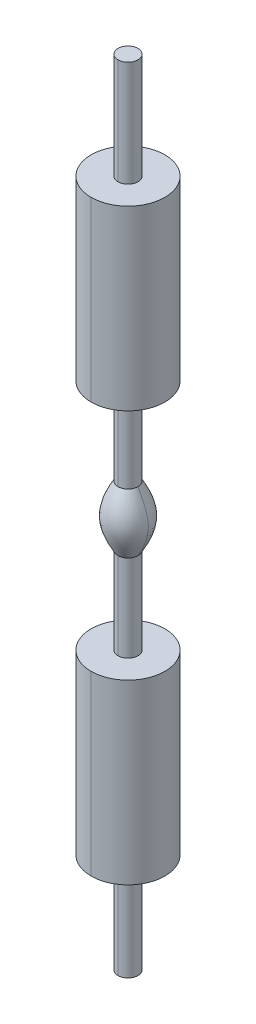
ISO-10303-21;
HEADER;
FILE_DESCRIPTION(('STEP AP214'),'2;1');
FILE_NAME('part.step','',(''),(''),'','','');
FILE_SCHEMA(('AUTOMOTIVE_DESIGN { 1 0 10303 214 1 1 1 1 }'));
ENDSEC;
DATA;
#1=APPLICATION_CONTEXT('core data for automotive mechanical design processes');
#2=APPLICATION_PROTOCOL_DEFINITION('international standard','automotive_design',2000,#1);
#3=PRODUCT_CONTEXT('',#1,'mechanical');
#4=PRODUCT('Part','Part','',(#3));
#5=PRODUCT_RELATED_PRODUCT_CATEGORY('part','',(#4));
#6=PRODUCT_DEFINITION_FORMATION('','',#4);
#7=PRODUCT_DEFINITION_CONTEXT('part definition',#1,'design');
#8=PRODUCT_DEFINITION('design','',#6,#7);
#9=PRODUCT_DEFINITION_SHAPE('','',#8);
#10=(LENGTH_UNIT() NAMED_UNIT(*) SI_UNIT(.MILLI.,.METRE.));
#11=(NAMED_UNIT(*) PLANE_ANGLE_UNIT() SI_UNIT($,.RADIAN.));
#12=(NAMED_UNIT(*) SI_UNIT($,.STERADIAN.) SOLID_ANGLE_UNIT());
#13=UNCERTAINTY_MEASURE_WITH_UNIT(LENGTH_MEASURE(1.E-05),#10,'distance_accuracy_value','');
#14=(GEOMETRIC_REPRESENTATION_CONTEXT(3) GLOBAL_UNCERTAINTY_ASSIGNED_CONTEXT((#13)) GLOBAL_UNIT_ASSIGNED_CONTEXT((#10,
#11,#12)) REPRESENTATION_CONTEXT('',''));
#15=CARTESIAN_POINT('',(0.,0.,0.));
#16=DIRECTION('',(0.,0.,1.));
#17=DIRECTION('',(1.,0.,0.));
#18=AXIS2_PLACEMENT_3D('',#15,#16,#17);
#19=CARTESIAN_POINT('',(0.500005206906543,18.7499969912657,0.));
#20=CARTESIAN_POINT('',(0.788928945114137,19.250007545074,0.));
#21=CARTESIAN_POINT('',(1.2503067253457,20.2500095556672,0.));
#22=CARTESIAN_POINT('',(0.788918573062737,21.2500115662508,0.));
#23=CARTESIAN_POINT('',(0.50000523162838,21.7500030230261,0.));
#24=(BOUNDED_CURVE() B_SPLINE_CURVE(3,(#19,#20,#21,#22,#23),.UNSPECIFIED.,.F.,
.F.) B_SPLINE_CURVE_WITH_KNOTS((4,1,4),(0.00909220591544138,0.5,0.990889044715894),
.UNSPECIFIED.) CURVE() GEOMETRIC_REPRESENTATION_ITEM() RATIONAL_B_SPLINE_CURVE((1.,1.,1.,1.,1.)) REPRESENTATION_ITEM(''));
#25=CARTESIAN_POINT('',(0.,21.9,0.));
#26=DIRECTION('',(0.,1.,0.));
#27=AXIS1_PLACEMENT('',#25,#26);
#28=SURFACE_OF_REVOLUTION('',#24,#27);
#29=CARTESIAN_POINT('',(0.500005206906542,18.7499969912657,0.));
#30=CARTESIAN_POINT('',(0.535846983327023,18.8120600065663,0.));
#31=CARTESIAN_POINT('',(0.571056216291898,18.8745129548328,0.));
#32=CARTESIAN_POINT('',(0.638943417699987,18.9994386156263,0.));
#33=CARTESIAN_POINT('',(0.671653651453235,19.0618938693806,0.));
#34=CARTESIAN_POINT('',(0.733881610883783,19.186841608421,0.));
#35=CARTESIAN_POINT('',(0.763450040943707,19.2493084498713,0.));
#36=CARTESIAN_POINT('',(0.80511160293922,19.3435696616243,0.));
#37=CARTESIAN_POINT('',(0.818448100943745,19.3748159722982,0.));
#38=CARTESIAN_POINT('',(0.844067404996357,19.4373145015259,0.));
#39=CARTESIAN_POINT('',(0.856360675567738,19.4685624113392,0.));
#40=CARTESIAN_POINT('',(0.87980800049009,19.5310638558944,0.));
#41=CARTESIAN_POINT('',(0.890973780078939,19.5623129783757,0.));
#42=CARTESIAN_POINT('',(0.912080674958987,19.6248172506307,0.));
#43=CARTESIAN_POINT('',(0.922034570370944,19.6560680674567,0.));
#44=CARTESIAN_POINT('',(0.940632493940187,19.718575705622,0.));
#45=CARTESIAN_POINT('',(0.949290011534879,19.7498284955897,0.));
#46=CARTESIAN_POINT('',(0.965210355596672,19.812339889142,0.));
#47=CARTESIAN_POINT('',(0.972486865215127,19.8435949896733,0.));
#48=CARTESIAN_POINT('',(0.985560933267878,19.9061105443433,0.));
#49=CARTESIAN_POINT('',(0.991371655645388,19.9373682283626,0.));
#50=CARTESIAN_POINT('',(1.00143065377806,19.9998883304118,0.));
#51=CARTESIAN_POINT('',(1.00569064820225,20.0311488480305,0.));
#52=CARTESIAN_POINT('',(1.01256569576742,20.0936736611226,0.));
#53=CARTESIAN_POINT('',(1.01518988744364,20.1249369416686,0.));
#54=CARTESIAN_POINT('',(1.01871198259125,20.1874670177884,0.));
#55=CARTESIAN_POINT('',(1.01961513631079,20.2187335107372,0.));
#56=CARTESIAN_POINT('',(1.0196153480541,20.2812664978396,0.));
#57=CARTESIAN_POINT('',(1.01871240640828,20.3125329919933,0.));
#58=CARTESIAN_POINT('',(1.01519067392152,20.3750630700732,0.));
#59=CARTESIAN_POINT('',(1.01256663303009,20.406326351417,0.));
#60=CARTESIAN_POINT('',(1.00569184793072,20.4688511659366,0.));
#61=CARTESIAN_POINT('',(1.00143196506839,20.5001116842078,0.));
#62=CARTESIAN_POINT('',(0.99137315092561,20.5626317873683,0.));
#63=CARTESIAN_POINT('',(0.985562500581587,20.5938894718171,0.));
#64=CARTESIAN_POINT('',(0.97248854329119,20.6564050272477,0.));
#65=CARTESIAN_POINT('',(0.965212071887006,20.6876601280238,0.));
#66=CARTESIAN_POINT('',(0.949291775049025,20.7501715220356,0.));
#67=CARTESIAN_POINT('',(0.94063426590677,20.781424312085,0.));
#68=CARTESIAN_POINT('',(0.922036334493111,20.8439319504441,0.));
#69=CARTESIAN_POINT('',(0.912082422254795,20.8751827672215,0.));
#70=CARTESIAN_POINT('',(0.890975473248938,20.9376870394469,0.));
#71=CARTESIAN_POINT('',(0.879809655899945,20.9689361617792,0.));
#72=CARTESIAN_POINT('',(0.856362239265325,21.0314376061206,0.));
#73=CARTESIAN_POINT('',(0.844068914373943,21.0626855157126,0.));
#74=CARTESIAN_POINT('',(0.818449489713174,21.1251840445771,0.));
#75=CARTESIAN_POINT('',(0.805112925153988,21.1564303549789,0.));
#76=CARTESIAN_POINT('',(0.76345114885323,21.2506915706206,0.));
#77=CARTESIAN_POINT('',(0.733882562637891,21.3131584095936,0.));
#78=CARTESIAN_POINT('',(0.671654295067989,21.4381061436226,0.));
#79=CARTESIAN_POINT('',(0.638943909404111,21.5005613947399,0.));
#80=CARTESIAN_POINT('',(0.571056440904352,21.6254870497,0.));
#81=CARTESIAN_POINT('',(0.535847093723119,21.6879399952251,0.));
#82=CARTESIAN_POINT('',(0.50000523162838,21.7500030230261,0.));
#83=B_SPLINE_CURVE_WITH_KNOTS('',3,(#29,#30,#31,#32,#33,#34,#35,#36,#37,#38,#39,#40,#41,#42,#43,
#44,#45,#46,#47,#48,#49,#50,#51,#52,#53,#54,#55,#56,#57,#58,#59,#60,#61,#62,#63,#64,#65,#66,#67,
#68,#69,#70,#71,#72,#73,#74,#75,#76,#77,#78,#79,#80,#81,#82),.UNSPECIFIED.,.F.,.F.,(4,2,2,2,2,2,
2,2,2,2,2,2,2,2,2,2,2,2,2,2,2,2,2,2,2,2,4),(0.,0.215034553041201,0.426507641724073,
0.633758188331105,0.735667144112722,0.836388987457099,0.935923000818633,1.03429452875705,
1.13155817921819,1.22780109173302,1.32314614809787,1.41775495347117,1.51183036809049,
1.60561833119817,1.69940627714775,1.79348165327409,1.88809041360923,1.98343542993342,
2.07967831584223,2.17694195870048,2.27531350103307,2.37484755152487,2.47556945354093,
2.57747848671433,2.78472922644701,2.99620252059585,3.21123723561501),.UNSPECIFIED.);
#84=CARTESIAN_POINT('',(0.5,18.75,0.));
#85=VERTEX_POINT('',#84);
#86=CARTESIAN_POINT('',(0.5,21.75,0.));
#87=VERTEX_POINT('',#86);
#88=EDGE_CURVE('E547',#85,#87,#83,.T.);
#89=ORIENTED_EDGE('',*,*,#88,.F.);
#90=CARTESIAN_POINT('',(0.,18.75,0.));
#91=DIRECTION('',(0.,1.,0.));
#92=DIRECTION('',(1.,0.,0.));
#93=AXIS2_PLACEMENT_3D('',#90,#91,#92);
#94=CIRCLE('',#93,0.5);
#95=CARTESIAN_POINT('',(0.,18.75,-0.5));
#96=VERTEX_POINT('',#95);
#97=EDGE_CURVE('E102',#85,#96,#94,.T.);
#98=ORIENTED_EDGE('',*,*,#97,.T.);
#99=CARTESIAN_POINT('',(0.,18.75,0.));
#100=DIRECTION('',(0.,1.,0.));
#101=DIRECTION('',(0.,0.,-1.));
#102=AXIS2_PLACEMENT_3D('',#99,#100,#101);
#103=CIRCLE('',#102,0.5);
#104=CARTESIAN_POINT('',(-0.5,18.75,0.));
#105=VERTEX_POINT('',#104);
#106=EDGE_CURVE('E171',#96,#105,#103,.T.);
#107=ORIENTED_EDGE('',*,*,#106,.T.);
#108=CARTESIAN_POINT('',(-0.500005206906542,18.7499969912657,0.));
#109=CARTESIAN_POINT('',(-0.535846983327023,18.8120600065663,0.));
#110=CARTESIAN_POINT('',(-0.571056216291898,18.8745129548328,0.));
#111=CARTESIAN_POINT('',(-0.638943417699987,18.9994386156263,0.));
#112=CARTESIAN_POINT('',(-0.671653651453235,19.0618938693806,0.));
#113=CARTESIAN_POINT('',(-0.733881610883783,19.186841608421,0.));
#114=CARTESIAN_POINT('',(-0.763450040943707,19.2493084498713,0.));
#115=CARTESIAN_POINT('',(-0.80511160293922,19.3435696616243,0.));
#116=CARTESIAN_POINT('',(-0.818448100943745,19.3748159722982,0.));
#117=CARTESIAN_POINT('',(-0.844067404996357,19.4373145015259,0.));
#118=CARTESIAN_POINT('',(-0.856360675567738,19.4685624113392,0.));
#119=CARTESIAN_POINT('',(-0.87980800049009,19.5310638558944,0.));
#120=CARTESIAN_POINT('',(-0.890973780078939,19.5623129783757,0.));
#121=CARTESIAN_POINT('',(-0.912080674958987,19.6248172506307,0.));
#122=CARTESIAN_POINT('',(-0.922034570370944,19.6560680674567,0.));
#123=CARTESIAN_POINT('',(-0.940632493940187,19.718575705622,0.));
#124=CARTESIAN_POINT('',(-0.949290011534879,19.7498284955897,0.));
#125=CARTESIAN_POINT('',(-0.965210355596672,19.812339889142,0.));
#126=CARTESIAN_POINT('',(-0.972486865215127,19.8435949896733,0.));
#127=CARTESIAN_POINT('',(-0.985560933267878,19.9061105443433,0.));
#128=CARTESIAN_POINT('',(-0.991371655645388,19.9373682283626,0.));
#129=CARTESIAN_POINT('',(-1.00143065377806,19.9998883304118,0.));
#130=CARTESIAN_POINT('',(-1.00569064820225,20.0311488480305,0.));
#131=CARTESIAN_POINT('',(-1.01256569576742,20.0936736611226,0.));
#132=CARTESIAN_POINT('',(-1.01518988744364,20.1249369416686,0.));
#133=CARTESIAN_POINT('',(-1.01871198259125,20.1874670177884,0.));
#134=CARTESIAN_POINT('',(-1.01961513631079,20.2187335107372,0.));
#135=CARTESIAN_POINT('',(-1.0196153480541,20.2812664978396,0.));
#136=CARTESIAN_POINT('',(-1.01871240640828,20.3125329919933,0.));
#137=CARTESIAN_POINT('',(-1.01519067392152,20.3750630700732,0.));
#138=CARTESIAN_POINT('',(-1.01256663303009,20.406326351417,0.));
#139=CARTESIAN_POINT('',(-1.00569184793072,20.4688511659366,0.));
#140=CARTESIAN_POINT('',(-1.00143196506839,20.5001116842078,0.));
#141=CARTESIAN_POINT('',(-0.99137315092561,20.5626317873683,0.));
#142=CARTESIAN_POINT('',(-0.985562500581587,20.5938894718171,0.));
#143=CARTESIAN_POINT('',(-0.97248854329119,20.6564050272477,0.));
#144=CARTESIAN_POINT('',(-0.965212071887006,20.6876601280238,0.));
#145=CARTESIAN_POINT('',(-0.949291775049025,20.7501715220356,0.));
#146=CARTESIAN_POINT('',(-0.94063426590677,20.781424312085,0.));
#147=CARTESIAN_POINT('',(-0.922036334493111,20.8439319504441,0.));
#148=CARTESIAN_POINT('',(-0.912082422254795,20.8751827672215,0.));
#149=CARTESIAN_POINT('',(-0.890975473248938,20.9376870394469,0.));
#150=CARTESIAN_POINT('',(-0.879809655899945,20.9689361617792,0.));
#151=CARTESIAN_POINT('',(-0.856362239265325,21.0314376061206,0.));
#152=CARTESIAN_POINT('',(-0.844068914373943,21.0626855157126,0.));
#153=CARTESIAN_POINT('',(-0.818449489713174,21.1251840445771,0.));
#154=CARTESIAN_POINT('',(-0.805112925153988,21.1564303549789,0.));
#155=CARTESIAN_POINT('',(-0.76345114885323,21.2506915706206,0.));
#156=CARTESIAN_POINT('',(-0.733882562637891,21.3131584095936,0.));
#157=CARTESIAN_POINT('',(-0.671654295067989,21.4381061436226,0.));
#158=CARTESIAN_POINT('',(-0.638943909404111,21.5005613947399,0.));
#159=CARTESIAN_POINT('',(-0.571056440904352,21.6254870497,0.));
#160=CARTESIAN_POINT('',(-0.535847093723119,21.6879399952251,0.));
#161=CARTESIAN_POINT('',(-0.50000523162838,21.7500030230261,0.));
#162=B_SPLINE_CURVE_WITH_KNOTS('',3,(#108,#109,#110,#111,#112,#113,#114,#115,#116,#117,#118,
#119,#120,#121,#122,#123,#124,#125,#126,#127,#128,#129,#130,#131,#132,#133,#134,#135,#136,#137,
#138,#139,#140,#141,#142,#143,#144,#145,#146,#147,#148,#149,#150,#151,#152,#153,#154,#155,#156,
#157,#158,#159,#160,#161),.UNSPECIFIED.,.F.,.F.,(4,2,2,2,2,2,2,2,2,2,2,2,2,2,2,2,2,2,2,2,2,2,2,
2,2,2,4),(0.,0.215034553041201,0.426507641724073,0.633758188331105,0.735667144112722,
0.836388987457099,0.935923000818633,1.03429452875705,1.13155817921819,1.22780109173302,
1.32314614809787,1.41775495347117,1.51183036809049,1.60561833119817,1.69940627714775,
1.79348165327409,1.88809041360923,1.98343542993342,2.07967831584223,2.17694195870048,
2.27531350103307,2.37484755152487,2.47556945354093,2.57747848671433,2.78472922644701,
2.99620252059585,3.21123723561501),.UNSPECIFIED.);
#163=CARTESIAN_POINT('',(-0.5,21.75,0.));
#164=VERTEX_POINT('',#163);
#165=EDGE_CURVE('E155',#105,#164,#162,.T.);
#166=ORIENTED_EDGE('',*,*,#165,.T.);
#167=CARTESIAN_POINT('',(0.,21.75,0.));
#168=DIRECTION('',(0.,-1.,0.));
#169=DIRECTION('',(-1.,0.,0.));
#170=AXIS2_PLACEMENT_3D('',#167,#168,#169);
#171=CIRCLE('',#170,0.5);
#172=CARTESIAN_POINT('',(0.,21.75,-0.5));
#173=VERTEX_POINT('',#172);
#174=EDGE_CURVE('E181',#164,#173,#171,.T.);
#175=ORIENTED_EDGE('',*,*,#174,.T.);
#176=CARTESIAN_POINT('',(0.,21.75,0.));
#177=DIRECTION('',(0.,-1.,0.));
#178=DIRECTION('',(0.,0.,-1.));
#179=AXIS2_PLACEMENT_3D('',#176,#177,#178);
#180=CIRCLE('',#179,0.5);
#181=EDGE_CURVE('E229',#173,#87,#180,.T.);
#182=ORIENTED_EDGE('',*,*,#181,.T.);
#183=EDGE_LOOP('',(#89,#98,#107,#166,#175,#182));
#184=FACE_BOUND('',#183,.T.);
#185=ADVANCED_FACE('F17',(#184),#28,.T.);
#186=CARTESIAN_POINT('',(0.,40.3,0.));
#187=DIRECTION('',(0.,-1.,0.));
#188=DIRECTION('',(0.,0.,-1.));
#189=AXIS2_PLACEMENT_3D('',#186,#187,#188);
#190=PLANE('',#189);
#191=CARTESIAN_POINT('',(0.,40.3,0.));
#192=DIRECTION('',(0.,-1.,0.));
#193=DIRECTION('',(0.,0.,-1.));
#194=AXIS2_PLACEMENT_3D('',#191,#192,#193);
#195=CIRCLE('',#194,0.5);
#196=CARTESIAN_POINT('',(0.,40.3,-0.5));
#197=VERTEX_POINT('',#196);
#198=CARTESIAN_POINT('',(0.,40.3,0.5));
#199=VERTEX_POINT('',#198);
#200=EDGE_CURVE('E80',#197,#199,#195,.T.);
#201=ORIENTED_EDGE('',*,*,#200,.F.);
#202=CARTESIAN_POINT('',(0.,40.3,0.));
#203=DIRECTION('',(0.,1.,0.));
#204=DIRECTION('',(0.,0.,-1.));
#205=AXIS2_PLACEMENT_3D('',#202,#203,#204);
#206=CIRCLE('',#205,0.5);
#207=EDGE_CURVE('E11',#197,#199,#206,.T.);
#208=ORIENTED_EDGE('',*,*,#207,.T.);
#209=EDGE_LOOP('',(#201,#208));
#210=FACE_BOUND('',#209,.T.);
#211=ADVANCED_FACE('F128',(#210),#190,.F.);
#212=CARTESIAN_POINT('',(0.,41.345,0.));
#213=DIRECTION('',(0.,-1.,0.));
#214=DIRECTION('',(0.,0.,1.));
#215=AXIS2_PLACEMENT_3D('',#212,#213,#214);
#216=CYLINDRICAL_SURFACE('',#215,0.5);
#217=CARTESIAN_POINT('',(0.,35.,0.));
#218=DIRECTION('',(0.,1.,0.));
#219=DIRECTION('',(0.,0.,-1.));
#220=AXIS2_PLACEMENT_3D('',#217,#218,#219);
#221=CIRCLE('',#220,0.5);
#222=CARTESIAN_POINT('',(0.,35.,-0.5));
#223=VERTEX_POINT('',#222);
#224=CARTESIAN_POINT('',(0.,35.,0.5));
#225=VERTEX_POINT('',#224);
#226=EDGE_CURVE('E69',#223,#225,#221,.T.);
#227=ORIENTED_EDGE('',*,*,#226,.T.);
#228=DIRECTION('',(0.,1.,0.));
#229=VECTOR('',#228,1.);
#230=CARTESIAN_POINT('',(0.,35.,0.5));
#231=LINE('',#230,#229);
#232=EDGE_CURVE('E73',#225,#199,#231,.T.);
#233=ORIENTED_EDGE('',*,*,#232,.T.);
#234=ORIENTED_EDGE('',*,*,#207,.F.);
#235=DIRECTION('',(0.,1.,0.));
#236=VECTOR('',#235,1.);
#237=CARTESIAN_POINT('',(0.,35.,-0.5));
#238=LINE('',#237,#236);
#239=EDGE_CURVE('E29',#223,#197,#238,.T.);
#240=ORIENTED_EDGE('',*,*,#239,.F.);
#241=EDGE_LOOP('',(#227,#233,#234,#240));
#242=FACE_BOUND('',#241,.T.);
#243=ADVANCED_FACE('F67',(#242),#216,.T.);
#244=CARTESIAN_POINT('',(0.,41.345,0.));
#245=DIRECTION('',(0.,-1.,0.));
#246=DIRECTION('',(0.,0.,1.));
#247=AXIS2_PLACEMENT_3D('',#244,#245,#246);
#248=CYLINDRICAL_SURFACE('',#247,0.5);
#249=ORIENTED_EDGE('',*,*,#200,.T.);
#250=ORIENTED_EDGE('',*,*,#232,.F.);
#251=CARTESIAN_POINT('',(0.,35.,0.));
#252=DIRECTION('',(0.,-1.,0.));
#253=DIRECTION('',(0.,0.,-1.));
#254=AXIS2_PLACEMENT_3D('',#251,#252,#253);
#255=CIRCLE('',#254,0.5);
#256=EDGE_CURVE('E76',#223,#225,#255,.T.);
#257=ORIENTED_EDGE('',*,*,#256,.F.);
#258=ORIENTED_EDGE('',*,*,#239,.T.);
#259=EDGE_LOOP('',(#249,#250,#257,#258));
#260=FACE_BOUND('',#259,.T.);
#261=ADVANCED_FACE('F77',(#260),#248,.T.);
#262=CARTESIAN_POINT('',(0.,35.,0.));
#263=DIRECTION('',(0.,-1.,0.));
#264=DIRECTION('',(0.,0.,-1.));
#265=AXIS2_PLACEMENT_3D('',#262,#263,#264);
#266=PLANE('',#265);
#267=ORIENTED_EDGE('',*,*,#226,.F.);
#268=ORIENTED_EDGE('',*,*,#256,.T.);
#269=EDGE_LOOP('',(#267,#268));
#270=FACE_BOUND('',#269,.T.);
#271=CARTESIAN_POINT('',(0.,35.,0.));
#272=DIRECTION('',(0.,-1.,0.));
#273=DIRECTION('',(0.,0.,-1.));
#274=AXIS2_PLACEMENT_3D('',#271,#272,#273);
#275=CIRCLE('',#274,1.85);
#276=CARTESIAN_POINT('',(0.,35.,-1.85));
#277=VERTEX_POINT('',#276);
#278=CARTESIAN_POINT('',(0.,35.,1.85));
#279=VERTEX_POINT('',#278);
#280=EDGE_CURVE('E95',#277,#279,#275,.T.);
#281=ORIENTED_EDGE('',*,*,#280,.F.);
#282=CARTESIAN_POINT('',(0.,35.,0.));
#283=DIRECTION('',(0.,1.,0.));
#284=DIRECTION('',(0.,0.,-1.));
#285=AXIS2_PLACEMENT_3D('',#282,#283,#284);
#286=CIRCLE('',#285,1.85);
#287=EDGE_CURVE('E85',#277,#279,#286,.T.);
#288=ORIENTED_EDGE('',*,*,#287,.T.);
#289=EDGE_LOOP('',(#281,#288));
#290=FACE_BOUND('',#289,.T.);
#291=ADVANCED_FACE('F82',(#270,#290),#266,.F.);
#292=CARTESIAN_POINT('',(0.,41.345,0.));
#293=DIRECTION('',(0.,-1.,0.));
#294=DIRECTION('',(0.,0.,1.));
#295=AXIS2_PLACEMENT_3D('',#292,#293,#294);
#296=CYLINDRICAL_SURFACE('',#295,1.85);
#297=CARTESIAN_POINT('',(0.,26.1,0.));
#298=DIRECTION('',(0.,1.,0.));
#299=DIRECTION('',(0.,0.,-1.));
#300=AXIS2_PLACEMENT_3D('',#297,#298,#299);
#301=CIRCLE('',#300,1.85);
#302=CARTESIAN_POINT('',(0.,26.1,-1.85));
#303=VERTEX_POINT('',#302);
#304=CARTESIAN_POINT('',(0.,26.1,1.85));
#305=VERTEX_POINT('',#304);
#306=EDGE_CURVE('E97',#303,#305,#301,.T.);
#307=ORIENTED_EDGE('',*,*,#306,.T.);
#308=DIRECTION('',(0.,1.,0.));
#309=VECTOR('',#308,1.);
#310=CARTESIAN_POINT('',(0.,26.1,1.85));
#311=LINE('',#310,#309);
#312=EDGE_CURVE('E106',#305,#279,#311,.T.);
#313=ORIENTED_EDGE('',*,*,#312,.T.);
#314=ORIENTED_EDGE('',*,*,#287,.F.);
#315=DIRECTION('',(0.,1.,0.));
#316=VECTOR('',#315,1.);
#317=CARTESIAN_POINT('',(0.,26.1,-1.85));
#318=LINE('',#317,#316);
#319=EDGE_CURVE('E91',#303,#277,#318,.T.);
#320=ORIENTED_EDGE('',*,*,#319,.F.);
#321=EDGE_LOOP('',(#307,#313,#314,#320));
#322=FACE_BOUND('',#321,.T.);
#323=ADVANCED_FACE('F356',(#322),#296,.T.);
#324=CARTESIAN_POINT('',(0.,41.345,0.));
#325=DIRECTION('',(0.,-1.,0.));
#326=DIRECTION('',(0.,0.,1.));
#327=AXIS2_PLACEMENT_3D('',#324,#325,#326);
#328=CYLINDRICAL_SURFACE('',#327,1.85);
#329=ORIENTED_EDGE('',*,*,#280,.T.);
#330=ORIENTED_EDGE('',*,*,#312,.F.);
#331=CARTESIAN_POINT('',(0.,26.1,0.));
#332=DIRECTION('',(0.,-1.,0.));
#333=DIRECTION('',(0.,0.,-1.));
#334=AXIS2_PLACEMENT_3D('',#331,#332,#333);
#335=CIRCLE('',#334,1.85);
#336=EDGE_CURVE('E101',#303,#305,#335,.T.);
#337=ORIENTED_EDGE('',*,*,#336,.F.);
#338=ORIENTED_EDGE('',*,*,#319,.T.);
#339=EDGE_LOOP('',(#329,#330,#337,#338));
#340=FACE_BOUND('',#339,.T.);
#341=ADVANCED_FACE('F351',(#340),#328,.T.);
#342=CARTESIAN_POINT('',(0.,26.1,0.));
#343=DIRECTION('',(0.,-1.,0.));
#344=DIRECTION('',(0.,0.,-1.));
#345=AXIS2_PLACEMENT_3D('',#342,#343,#344);
#346=PLANE('',#345);
#347=CARTESIAN_POINT('',(0.,26.1,0.));
#348=DIRECTION('',(0.,-1.,0.));
#349=DIRECTION('',(0.,0.,-1.));
#350=AXIS2_PLACEMENT_3D('',#347,#348,#349);
#351=CIRCLE('',#350,0.5);
#352=CARTESIAN_POINT('',(0.,26.1,-0.5));
#353=VERTEX_POINT('',#352);
#354=CARTESIAN_POINT('',(0.,26.1,0.5));
#355=VERTEX_POINT('',#354);
#356=EDGE_CURVE('E227',#353,#355,#351,.T.);
#357=ORIENTED_EDGE('',*,*,#356,.F.);
#358=CARTESIAN_POINT('',(0.,26.1,0.));
#359=DIRECTION('',(0.,1.,0.));
#360=DIRECTION('',(0.,0.,-1.));
#361=AXIS2_PLACEMENT_3D('',#358,#359,#360);
#362=CIRCLE('',#361,0.5);
#363=EDGE_CURVE('E194',#353,#355,#362,.T.);
#364=ORIENTED_EDGE('',*,*,#363,.T.);
#365=EDGE_LOOP('',(#357,#364));
#366=FACE_BOUND('',#365,.T.);
#367=ORIENTED_EDGE('',*,*,#306,.F.);
#368=ORIENTED_EDGE('',*,*,#336,.T.);
#369=EDGE_LOOP('',(#367,#368));
#370=FACE_BOUND('',#369,.T.);
#371=ADVANCED_FACE('F355',(#366,#370),#346,.T.);
#372=CARTESIAN_POINT('',(0.,20.345,0.));
#373=DIRECTION('',(0.,-1.,0.));
#374=DIRECTION('',(0.,0.,1.));
#375=AXIS2_PLACEMENT_3D('',#372,#373,#374);
#376=CYLINDRICAL_SURFACE('',#375,0.5);
#377=DIRECTION('',(0.,-1.,0.));
#378=VECTOR('',#377,1.);
#379=CARTESIAN_POINT('',(0.,18.75,0.5));
#380=LINE('',#379,#378);
#381=CARTESIAN_POINT('',(0.,18.75,0.5));
#382=VERTEX_POINT('',#381);
#383=CARTESIAN_POINT('',(0.,14.4,0.5));
#384=VERTEX_POINT('',#383);
#385=EDGE_CURVE('E168',#382,#384,#380,.T.);
#386=ORIENTED_EDGE('',*,*,#385,.T.);
#387=CARTESIAN_POINT('',(0.,14.4,0.));
#388=DIRECTION('',(0.,-1.,0.));
#389=DIRECTION('',(0.,0.,-1.));
#390=AXIS2_PLACEMENT_3D('',#387,#388,#389);
#391=CIRCLE('',#390,0.5);
#392=CARTESIAN_POINT('',(0.,14.4,-0.5));
#393=VERTEX_POINT('',#392);
#394=EDGE_CURVE('E215',#393,#384,#391,.T.);
#395=ORIENTED_EDGE('',*,*,#394,.F.);
#396=DIRECTION('',(0.,1.,0.));
#397=VECTOR('',#396,1.);
#398=CARTESIAN_POINT('',(0.,14.4,-0.5));
#399=LINE('',#398,#397);
#400=EDGE_CURVE('E175',#393,#96,#399,.T.);
#401=ORIENTED_EDGE('',*,*,#400,.T.);
#402=ORIENTED_EDGE('',*,*,#97,.F.);
#403=CARTESIAN_POINT('',(0.,18.75,0.));
#404=DIRECTION('',(0.,1.,0.));
#405=DIRECTION('',(0.,0.,1.));
#406=AXIS2_PLACEMENT_3D('',#403,#404,#405);
#407=CIRCLE('',#406,0.5);
#408=EDGE_CURVE('E244',#382,#85,#407,.T.);
#409=ORIENTED_EDGE('',*,*,#408,.F.);
#410=EDGE_LOOP('',(#386,#395,#401,#402,#409));
#411=FACE_BOUND('',#410,.T.);
#412=ADVANCED_FACE('F238',(#411),#376,.T.);
#413=CARTESIAN_POINT('',(0.,20.345,0.));
#414=DIRECTION('',(0.,-1.,0.));
#415=DIRECTION('',(0.,0.,1.));
#416=AXIS2_PLACEMENT_3D('',#413,#414,#415);
#417=CYLINDRICAL_SURFACE('',#416,0.5);
#418=ORIENTED_EDGE('',*,*,#181,.F.);
#419=DIRECTION('',(0.,1.,0.));
#420=VECTOR('',#419,1.);
#421=CARTESIAN_POINT('',(0.,21.75,-0.5));
#422=LINE('',#421,#420);
#423=EDGE_CURVE('E185',#173,#353,#422,.T.);
#424=ORIENTED_EDGE('',*,*,#423,.T.);
#425=ORIENTED_EDGE('',*,*,#356,.T.);
#426=DIRECTION('',(0.,-1.,0.));
#427=VECTOR('',#426,1.);
#428=CARTESIAN_POINT('',(0.,26.1,0.5));
#429=LINE('',#428,#427);
#430=CARTESIAN_POINT('',(0.,21.75,0.5));
#431=VERTEX_POINT('',#430);
#432=EDGE_CURVE('E206',#355,#431,#429,.T.);
#433=ORIENTED_EDGE('',*,*,#432,.T.);
#434=CARTESIAN_POINT('',(0.,21.75,0.));
#435=DIRECTION('',(0.,-1.,0.));
#436=DIRECTION('',(1.,0.,0.));
#437=AXIS2_PLACEMENT_3D('',#434,#435,#436);
#438=CIRCLE('',#437,0.5);
#439=EDGE_CURVE('E551',#87,#431,#438,.T.);
#440=ORIENTED_EDGE('',*,*,#439,.F.);
#441=EDGE_LOOP('',(#418,#424,#425,#433,#440));
#442=FACE_BOUND('',#441,.T.);
#443=ADVANCED_FACE('F432',(#442),#417,.T.);
#444=CARTESIAN_POINT('',(0.500005206906543,18.7499969912657,0.));
#445=CARTESIAN_POINT('',(0.788928945114137,19.250007545074,0.));
#446=CARTESIAN_POINT('',(1.2503067253457,20.2500095556672,0.));
#447=CARTESIAN_POINT('',(0.788918573062737,21.2500115662508,0.));
#448=CARTESIAN_POINT('',(0.50000523162838,21.7500030230261,0.));
#449=(BOUNDED_CURVE() B_SPLINE_CURVE(3,(#444,#445,#446,#447,#448),.UNSPECIFIED.,.F.,
.F.) B_SPLINE_CURVE_WITH_KNOTS((4,1,4),(0.00909220591544138,0.5,0.990889044715894),
.UNSPECIFIED.) CURVE() GEOMETRIC_REPRESENTATION_ITEM() RATIONAL_B_SPLINE_CURVE((1.,1.,1.,1.,1.)) REPRESENTATION_ITEM(''));
#450=CARTESIAN_POINT('',(0.,21.9,0.));
#451=DIRECTION('',(0.,1.,0.));
#452=AXIS1_PLACEMENT('',#450,#451);
#453=SURFACE_OF_REVOLUTION('',#449,#452);
#454=CARTESIAN_POINT('',(0.,21.75,0.));
#455=DIRECTION('',(0.,-1.,0.));
#456=DIRECTION('',(0.,0.,1.));
#457=AXIS2_PLACEMENT_3D('',#454,#455,#456);
#458=CIRCLE('',#457,0.5);
#459=EDGE_CURVE('E176',#431,#164,#458,.T.);
#460=ORIENTED_EDGE('',*,*,#459,.T.);
#461=ORIENTED_EDGE('',*,*,#165,.F.);
#462=CARTESIAN_POINT('',(0.,18.75,0.));
#463=DIRECTION('',(0.,1.,0.));
#464=DIRECTION('',(-1.,0.,0.));
#465=AXIS2_PLACEMENT_3D('',#462,#463,#464);
#466=CIRCLE('',#465,0.5);
#467=EDGE_CURVE('E160',#105,#382,#466,.T.);
#468=ORIENTED_EDGE('',*,*,#467,.T.);
#469=ORIENTED_EDGE('',*,*,#408,.T.);
#470=ORIENTED_EDGE('',*,*,#88,.T.);
#471=ORIENTED_EDGE('',*,*,#439,.T.);
#472=EDGE_LOOP('',(#460,#461,#468,#469,#470,#471));
#473=FACE_BOUND('',#472,.T.);
#474=ADVANCED_FACE('F19',(#473),#453,.T.);
#475=CARTESIAN_POINT('',(0.,20.345,0.));
#476=DIRECTION('',(0.,-1.,0.));
#477=DIRECTION('',(0.,0.,1.));
#478=AXIS2_PLACEMENT_3D('',#475,#476,#477);
#479=CYLINDRICAL_SURFACE('',#478,0.5);
#480=ORIENTED_EDGE('',*,*,#106,.F.);
#481=ORIENTED_EDGE('',*,*,#400,.F.);
#482=CARTESIAN_POINT('',(0.,14.4,0.));
#483=DIRECTION('',(0.,1.,0.));
#484=DIRECTION('',(0.,0.,-1.));
#485=AXIS2_PLACEMENT_3D('',#482,#483,#484);
#486=CIRCLE('',#485,0.5);
#487=EDGE_CURVE('E216',#393,#384,#486,.T.);
#488=ORIENTED_EDGE('',*,*,#487,.T.);
#489=ORIENTED_EDGE('',*,*,#385,.F.);
#490=ORIENTED_EDGE('',*,*,#467,.F.);
#491=EDGE_LOOP('',(#480,#481,#488,#489,#490));
#492=FACE_BOUND('',#491,.T.);
#493=ADVANCED_FACE('F252',(#492),#479,.T.);
#494=CARTESIAN_POINT('',(0.,20.345,0.));
#495=DIRECTION('',(0.,-1.,0.));
#496=DIRECTION('',(0.,0.,1.));
#497=AXIS2_PLACEMENT_3D('',#494,#495,#496);
#498=CYLINDRICAL_SURFACE('',#497,0.5);
#499=ORIENTED_EDGE('',*,*,#432,.F.);
#500=ORIENTED_EDGE('',*,*,#363,.F.);
#501=ORIENTED_EDGE('',*,*,#423,.F.);
#502=ORIENTED_EDGE('',*,*,#174,.F.);
#503=ORIENTED_EDGE('',*,*,#459,.F.);
#504=EDGE_LOOP('',(#499,#500,#501,#502,#503));
#505=FACE_BOUND('',#504,.T.);
#506=ADVANCED_FACE('F453',(#505),#498,.T.);
#507=CARTESIAN_POINT('',(0.,14.4,0.));
#508=DIRECTION('',(0.,-1.,0.));
#509=DIRECTION('',(0.,0.,-1.));
#510=AXIS2_PLACEMENT_3D('',#507,#508,#509);
#511=PLANE('',#510);
#512=ORIENTED_EDGE('',*,*,#394,.T.);
#513=ORIENTED_EDGE('',*,*,#487,.F.);
#514=EDGE_LOOP('',(#512,#513));
#515=FACE_BOUND('',#514,.T.);
#516=CARTESIAN_POINT('',(0.,14.4,0.));
#517=DIRECTION('',(0.,1.,0.));
#518=DIRECTION('',(0.,0.,-1.));
#519=AXIS2_PLACEMENT_3D('',#516,#517,#518);
#520=CIRCLE('',#519,1.85);
#521=CARTESIAN_POINT('',(0.,14.4,-1.85));
#522=VERTEX_POINT('',#521);
#523=CARTESIAN_POINT('',(0.,14.4,1.85));
#524=VERTEX_POINT('',#523);
#525=EDGE_CURVE('E285',#522,#524,#520,.T.);
#526=ORIENTED_EDGE('',*,*,#525,.T.);
#527=CARTESIAN_POINT('',(0.,14.4,0.));
#528=DIRECTION('',(0.,-1.,0.));
#529=DIRECTION('',(0.,0.,-1.));
#530=AXIS2_PLACEMENT_3D('',#527,#528,#529);
#531=CIRCLE('',#530,1.85);
#532=EDGE_CURVE('E212',#522,#524,#531,.T.);
#533=ORIENTED_EDGE('',*,*,#532,.F.);
#534=EDGE_LOOP('',(#526,#533));
#535=FACE_BOUND('',#534,.T.);
#536=ADVANCED_FACE('F254',(#515,#535),#511,.F.);
#537=CARTESIAN_POINT('',(0.,20.345,0.));
#538=DIRECTION('',(0.,-1.,0.));
#539=DIRECTION('',(0.,0.,1.));
#540=AXIS2_PLACEMENT_3D('',#537,#538,#539);
#541=CYLINDRICAL_SURFACE('',#540,1.85);
#542=ORIENTED_EDGE('',*,*,#532,.T.);
#543=DIRECTION('',(0.,1.,0.));
#544=VECTOR('',#543,1.);
#545=CARTESIAN_POINT('',(0.,5.5,1.85));
#546=LINE('',#545,#544);
#547=CARTESIAN_POINT('',(0.,5.5,1.85));
#548=VERTEX_POINT('',#547);
#549=EDGE_CURVE('E268',#548,#524,#546,.T.);
#550=ORIENTED_EDGE('',*,*,#549,.F.);
#551=CARTESIAN_POINT('',(0.,5.5,0.));
#552=DIRECTION('',(0.,-1.,0.));
#553=DIRECTION('',(0.,0.,-1.));
#554=AXIS2_PLACEMENT_3D('',#551,#552,#553);
#555=CIRCLE('',#554,1.85);
#556=CARTESIAN_POINT('',(0.,5.5,-1.85));
#557=VERTEX_POINT('',#556);
#558=EDGE_CURVE('E269',#557,#548,#555,.T.);
#559=ORIENTED_EDGE('',*,*,#558,.F.);
#560=DIRECTION('',(0.,1.,0.));
#561=VECTOR('',#560,1.);
#562=CARTESIAN_POINT('',(0.,5.5,-1.85));
#563=LINE('',#562,#561);
#564=EDGE_CURVE('E210',#557,#522,#563,.T.);
#565=ORIENTED_EDGE('',*,*,#564,.T.);
#566=EDGE_LOOP('',(#542,#550,#559,#565));
#567=FACE_BOUND('',#566,.T.);
#568=ADVANCED_FACE('F298',(#567),#541,.T.);
#569=CARTESIAN_POINT('',(0.,20.345,0.));
#570=DIRECTION('',(0.,-1.,0.));
#571=DIRECTION('',(0.,0.,1.));
#572=AXIS2_PLACEMENT_3D('',#569,#570,#571);
#573=CYLINDRICAL_SURFACE('',#572,1.85);
#574=CARTESIAN_POINT('',(0.,5.5,0.));
#575=DIRECTION('',(0.,1.,0.));
#576=DIRECTION('',(0.,0.,-1.));
#577=AXIS2_PLACEMENT_3D('',#574,#575,#576);
#578=CIRCLE('',#577,1.85);
#579=EDGE_CURVE('E264',#557,#548,#578,.T.);
#580=ORIENTED_EDGE('',*,*,#579,.T.);
#581=ORIENTED_EDGE('',*,*,#549,.T.);
#582=ORIENTED_EDGE('',*,*,#525,.F.);
#583=ORIENTED_EDGE('',*,*,#564,.F.);
#584=EDGE_LOOP('',(#580,#581,#582,#583));
#585=FACE_BOUND('',#584,.T.);
#586=ADVANCED_FACE('F305',(#585),#573,.T.);
#587=CARTESIAN_POINT('',(0.,5.5,0.));
#588=DIRECTION('',(0.,-1.,0.));
#589=DIRECTION('',(0.,0.,-1.));
#590=AXIS2_PLACEMENT_3D('',#587,#588,#589);
#591=PLANE('',#590);
#592=CARTESIAN_POINT('',(0.,5.5,0.));
#593=DIRECTION('',(0.,1.,0.));
#594=DIRECTION('',(0.,0.,-1.));
#595=AXIS2_PLACEMENT_3D('',#592,#593,#594);
#596=CIRCLE('',#595,0.5);
#597=CARTESIAN_POINT('',(0.,5.5,-0.5));
#598=VERTEX_POINT('',#597);
#599=CARTESIAN_POINT('',(0.,5.5,0.5));
#600=VERTEX_POINT('',#599);
#601=EDGE_CURVE('E270',#598,#600,#596,.T.);
#602=ORIENTED_EDGE('',*,*,#601,.T.);
#603=CARTESIAN_POINT('',(0.,5.5,0.));
#604=DIRECTION('',(0.,-1.,0.));
#605=DIRECTION('',(0.,0.,-1.));
#606=AXIS2_PLACEMENT_3D('',#603,#604,#605);
#607=CIRCLE('',#606,0.5);
#608=EDGE_CURVE('E279',#598,#600,#607,.T.);
#609=ORIENTED_EDGE('',*,*,#608,.F.);
#610=EDGE_LOOP('',(#602,#609));
#611=FACE_BOUND('',#610,.T.);
#612=ORIENTED_EDGE('',*,*,#558,.T.);
#613=ORIENTED_EDGE('',*,*,#579,.F.);
#614=EDGE_LOOP('',(#612,#613));
#615=FACE_BOUND('',#614,.T.);
#616=ADVANCED_FACE('F482',(#611,#615),#591,.T.);
#617=CARTESIAN_POINT('',(0.,20.345,0.));
#618=DIRECTION('',(0.,-1.,0.));
#619=DIRECTION('',(0.,0.,1.));
#620=AXIS2_PLACEMENT_3D('',#617,#618,#619);
#621=CYLINDRICAL_SURFACE('',#620,0.5);
#622=ORIENTED_EDGE('',*,*,#608,.T.);
#623=DIRECTION('',(0.,1.,0.));
#624=VECTOR('',#623,1.);
#625=CARTESIAN_POINT('',(0.,0.5,0.5));
#626=LINE('',#625,#624);
#627=CARTESIAN_POINT('',(0.,0.5,0.5));
#628=VERTEX_POINT('',#627);
#629=EDGE_CURVE('E275',#628,#600,#626,.T.);
#630=ORIENTED_EDGE('',*,*,#629,.F.);
#631=CARTESIAN_POINT('',(0.,0.5,0.));
#632=DIRECTION('',(0.,-1.,0.));
#633=DIRECTION('',(0.,0.,-1.));
#634=AXIS2_PLACEMENT_3D('',#631,#632,#633);
#635=CIRCLE('',#634,0.5);
#636=CARTESIAN_POINT('',(0.,0.5,-0.5));
#637=VERTEX_POINT('',#636);
#638=EDGE_CURVE('E596',#637,#628,#635,.T.);
#639=ORIENTED_EDGE('',*,*,#638,.F.);
#640=DIRECTION('',(0.,1.,0.));
#641=VECTOR('',#640,1.);
#642=CARTESIAN_POINT('',(0.,0.5,-0.5));
#643=LINE('',#642,#641);
#644=EDGE_CURVE('E274',#637,#598,#643,.T.);
#645=ORIENTED_EDGE('',*,*,#644,.T.);
#646=EDGE_LOOP('',(#622,#630,#639,#645));
#647=FACE_BOUND('',#646,.T.);
#648=ADVANCED_FACE('F490',(#647),#621,.T.);
#649=CARTESIAN_POINT('',(0.,20.345,0.));
#650=DIRECTION('',(0.,-1.,0.));
#651=DIRECTION('',(0.,0.,1.));
#652=AXIS2_PLACEMENT_3D('',#649,#650,#651);
#653=CYLINDRICAL_SURFACE('',#652,0.5);
#654=CARTESIAN_POINT('',(0.,0.5,0.));
#655=DIRECTION('',(0.,1.,0.));
#656=DIRECTION('',(0.,0.,-1.));
#657=AXIS2_PLACEMENT_3D('',#654,#655,#656);
#658=CIRCLE('',#657,0.5);
#659=EDGE_CURVE('E261',#637,#628,#658,.T.);
#660=ORIENTED_EDGE('',*,*,#659,.T.);
#661=ORIENTED_EDGE('',*,*,#629,.T.);
#662=ORIENTED_EDGE('',*,*,#601,.F.);
#663=ORIENTED_EDGE('',*,*,#644,.F.);
#664=EDGE_LOOP('',(#660,#661,#662,#663));
#665=FACE_BOUND('',#664,.T.);
#666=ADVANCED_FACE('F499',(#665),#653,.T.);
#667=CARTESIAN_POINT('',(0.,0.5,0.));
#668=DIRECTION('',(0.,-1.,0.));
#669=DIRECTION('',(0.,0.,-1.));
#670=AXIS2_PLACEMENT_3D('',#667,#668,#669);
#671=PLANE('',#670);
#672=ORIENTED_EDGE('',*,*,#638,.T.);
#673=ORIENTED_EDGE('',*,*,#659,.F.);
#674=EDGE_LOOP('',(#672,#673));
#675=FACE_BOUND('',#674,.T.);
#676=ADVANCED_FACE('F508',(#675),#671,.T.);
#677=CLOSED_SHELL('',(#185,#211,#243,#261,#291,#323,#341,#371,#412,#443,#474,#493,#506,#536,
#568,#586,#616,#648,#666,#676));
#678=MANIFOLD_SOLID_BREP('B1',#677);
#679=ADVANCED_BREP_SHAPE_REPRESENTATION('',(#18,#678),#14);
#680=SHAPE_DEFINITION_REPRESENTATION(#9,#679);
ENDSEC;
END-ISO-10303-21;
